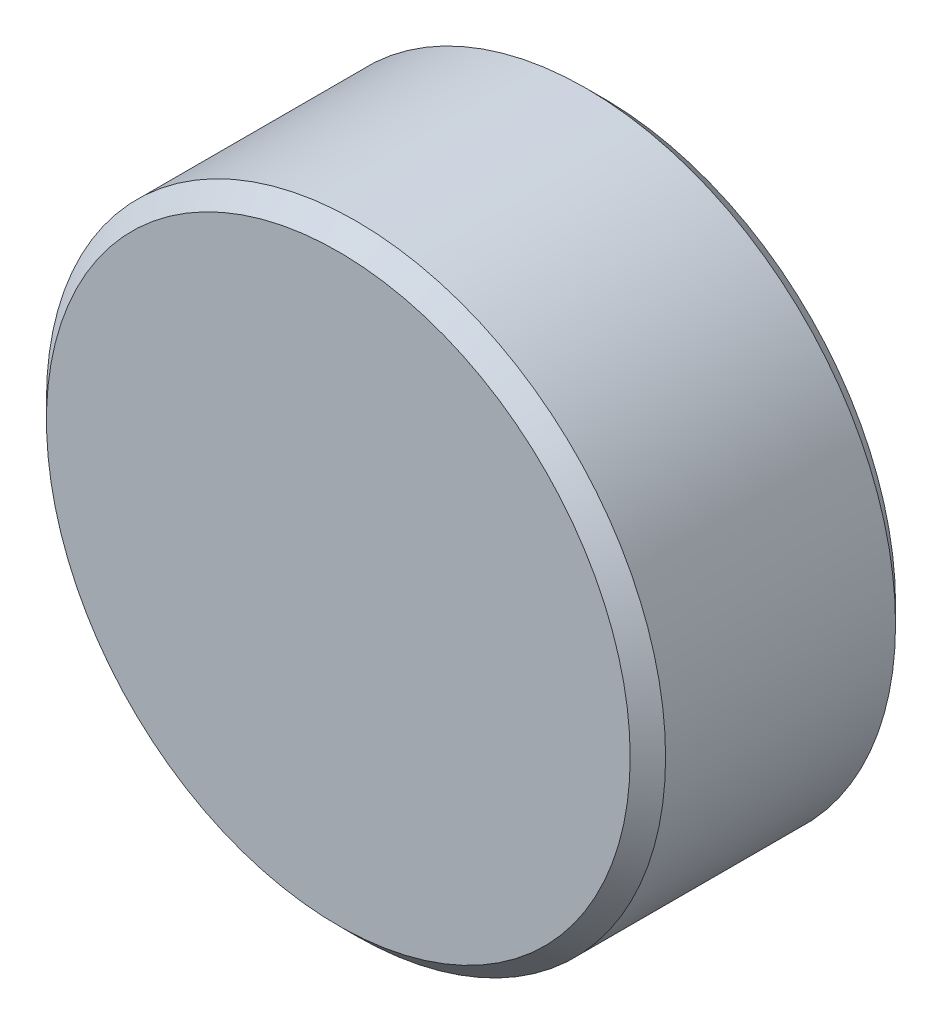
ISO-10303-21;
HEADER;
FILE_DESCRIPTION(('STEP AP214'),'2;1');
FILE_NAME('part.step','',(''),(''),'','','');
FILE_SCHEMA(('AUTOMOTIVE_DESIGN { 1 0 10303 214 1 1 1 1 }'));
ENDSEC;
DATA;
#1=APPLICATION_CONTEXT('core data for automotive mechanical design processes');
#2=APPLICATION_PROTOCOL_DEFINITION('international standard','automotive_design',2000,#1);
#3=PRODUCT_CONTEXT('',#1,'mechanical');
#4=PRODUCT('Part','Part','',(#3));
#5=PRODUCT_RELATED_PRODUCT_CATEGORY('part','',(#4));
#6=PRODUCT_DEFINITION_FORMATION('','',#4);
#7=PRODUCT_DEFINITION_CONTEXT('part definition',#1,'design');
#8=PRODUCT_DEFINITION('design','',#6,#7);
#9=PRODUCT_DEFINITION_SHAPE('','',#8);
#10=(LENGTH_UNIT() NAMED_UNIT(*) SI_UNIT(.MILLI.,.METRE.));
#11=(NAMED_UNIT(*) PLANE_ANGLE_UNIT() SI_UNIT($,.RADIAN.));
#12=(NAMED_UNIT(*) SI_UNIT($,.STERADIAN.) SOLID_ANGLE_UNIT());
#13=UNCERTAINTY_MEASURE_WITH_UNIT(LENGTH_MEASURE(1.E-05),#10,'distance_accuracy_value','');
#14=(GEOMETRIC_REPRESENTATION_CONTEXT(3) GLOBAL_UNCERTAINTY_ASSIGNED_CONTEXT((#13)) GLOBAL_UNIT_ASSIGNED_CONTEXT((#10,
#11,#12)) REPRESENTATION_CONTEXT('',''));
#15=CARTESIAN_POINT('',(0.,0.,0.));
#16=DIRECTION('',(0.,0.,1.));
#17=DIRECTION('',(1.,0.,0.));
#18=AXIS2_PLACEMENT_3D('',#15,#16,#17);
#19=CARTESIAN_POINT('',(0.,0.,30.));
#20=DIRECTION('',(0.,0.,-1.));
#21=DIRECTION('',(-1.,0.,0.));
#22=AXIS2_PLACEMENT_3D('',#19,#20,#21);
#23=CYLINDRICAL_SURFACE('',#22,35.);
#24=CARTESIAN_POINT('',(0.,0.,2.00000000000002));
#25=DIRECTION('',(0.,0.,1.));
#26=DIRECTION('',(1.,0.,0.));
#27=AXIS2_PLACEMENT_3D('',#24,#25,#26);
#28=CIRCLE('',#27,35.);
#29=CARTESIAN_POINT('',(35.,0.,2.00000000000002));
#30=VERTEX_POINT('',#29);
#31=EDGE_CURVE('E38',#30,#30,#28,.T.);
#32=ORIENTED_EDGE('',*,*,#31,.T.);
#33=EDGE_LOOP('',(#32));
#34=FACE_BOUND('',#33,.T.);
#35=CARTESIAN_POINT('',(0.,0.,28.));
#36=DIRECTION('',(0.,0.,1.));
#37=DIRECTION('',(1.,0.,0.));
#38=AXIS2_PLACEMENT_3D('',#35,#36,#37);
#39=CIRCLE('',#38,35.);
#40=CARTESIAN_POINT('',(35.,0.,28.));
#41=VERTEX_POINT('',#40);
#42=EDGE_CURVE('E42',#41,#41,#39,.F.);
#43=ORIENTED_EDGE('',*,*,#42,.T.);
#44=EDGE_LOOP('',(#43));
#45=FACE_BOUND('',#44,.T.);
#46=ADVANCED_FACE('F31',(#34,#45),#23,.T.);
#47=CARTESIAN_POINT('',(0.,0.,30.));
#48=DIRECTION('',(0.,0.,1.));
#49=DIRECTION('',(1.,0.,0.));
#50=AXIS2_PLACEMENT_3D('',#47,#48,#49);
#51=PLANE('',#50);
#52=CARTESIAN_POINT('',(0.,0.,30.));
#53=DIRECTION('',(0.,0.,1.));
#54=DIRECTION('',(1.,0.,0.));
#55=AXIS2_PLACEMENT_3D('',#52,#53,#54);
#56=CIRCLE('',#55,33.);
#57=CARTESIAN_POINT('',(33.,0.,30.));
#58=VERTEX_POINT('',#57);
#59=EDGE_CURVE('E46',#58,#58,#56,.T.);
#60=ORIENTED_EDGE('',*,*,#59,.T.);
#61=EDGE_LOOP('',(#60));
#62=FACE_BOUND('',#61,.T.);
#63=ADVANCED_FACE('F52',(#62),#51,.T.);
#64=CARTESIAN_POINT('',(0.,0.,0.));
#65=DIRECTION('',(0.,0.,1.));
#66=DIRECTION('',(1.,0.,0.));
#67=AXIS2_PLACEMENT_3D('',#64,#65,#66);
#68=PLANE('',#67);
#69=CARTESIAN_POINT('',(0.,0.,0.));
#70=DIRECTION('',(0.,0.,1.));
#71=DIRECTION('',(1.,0.,0.));
#72=AXIS2_PLACEMENT_3D('',#69,#70,#71);
#73=CIRCLE('',#72,33.);
#74=CARTESIAN_POINT('',(33.,0.,0.));
#75=VERTEX_POINT('',#74);
#76=EDGE_CURVE('E10',#75,#75,#73,.F.);
#77=ORIENTED_EDGE('',*,*,#76,.T.);
#78=EDGE_LOOP('',(#77));
#79=FACE_BOUND('',#78,.T.);
#80=ADVANCED_FACE('F56',(#79),#68,.F.);
#81=CARTESIAN_POINT('',(0.,0.,30.));
#82=DIRECTION('',(0.,0.,-1.));
#83=DIRECTION('',(-1.,0.,0.));
#84=AXIS2_PLACEMENT_3D('',#81,#82,#83);
#85=CONICAL_SURFACE('',#84,33.,0.785398163397445);
#86=ORIENTED_EDGE('',*,*,#42,.F.);
#87=EDGE_LOOP('',(#86));
#88=FACE_BOUND('',#87,.T.);
#89=ORIENTED_EDGE('',*,*,#59,.F.);
#90=EDGE_LOOP('',(#89));
#91=FACE_BOUND('',#90,.T.);
#92=ADVANCED_FACE('F54',(#88,#91),#85,.T.);
#93=CARTESIAN_POINT('',(0.,0.,2.00000000000002));
#94=DIRECTION('',(0.,0.,1.));
#95=DIRECTION('',(1.,0.,0.));
#96=AXIS2_PLACEMENT_3D('',#93,#94,#95);
#97=CONICAL_SURFACE('',#96,35.,0.78539816339745);
#98=ORIENTED_EDGE('',*,*,#76,.F.);
#99=EDGE_LOOP('',(#98));
#100=FACE_BOUND('',#99,.T.);
#101=ORIENTED_EDGE('',*,*,#31,.F.);
#102=EDGE_LOOP('',(#101));
#103=FACE_BOUND('',#102,.T.);
#104=ADVANCED_FACE('F33',(#100,#103),#97,.T.);
#105=CLOSED_SHELL('',(#46,#63,#80,#92,#104));
#106=MANIFOLD_SOLID_BREP('B2',#105);
#107=ADVANCED_BREP_SHAPE_REPRESENTATION('',(#18,#106),#14);
#108=SHAPE_DEFINITION_REPRESENTATION(#9,#107);
ENDSEC;
END-ISO-10303-21;
